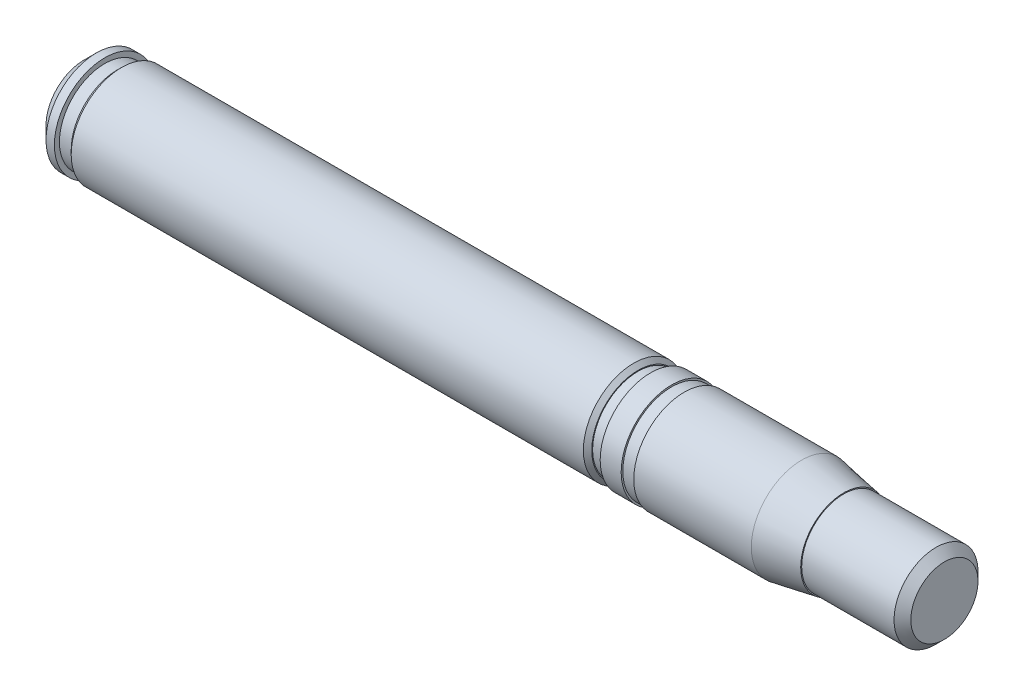
ISO-10303-21;
HEADER;
FILE_DESCRIPTION(('STEP AP214'),'2;1');
FILE_NAME('part.step','',(''),(''),'','','');
FILE_SCHEMA(('AUTOMOTIVE_DESIGN { 1 0 10303 214 1 1 1 1 }'));
ENDSEC;
DATA;
#1=APPLICATION_CONTEXT('core data for automotive mechanical design processes');
#2=APPLICATION_PROTOCOL_DEFINITION('international standard','automotive_design',2000,#1);
#3=PRODUCT_CONTEXT('',#1,'mechanical');
#4=PRODUCT('Part','Part','',(#3));
#5=PRODUCT_RELATED_PRODUCT_CATEGORY('part','',(#4));
#6=PRODUCT_DEFINITION_FORMATION('','',#4);
#7=PRODUCT_DEFINITION_CONTEXT('part definition',#1,'design');
#8=PRODUCT_DEFINITION('design','',#6,#7);
#9=PRODUCT_DEFINITION_SHAPE('','',#8);
#10=(LENGTH_UNIT() NAMED_UNIT(*) SI_UNIT(.MILLI.,.METRE.));
#11=(NAMED_UNIT(*) PLANE_ANGLE_UNIT() SI_UNIT($,.RADIAN.));
#12=(NAMED_UNIT(*) SI_UNIT($,.STERADIAN.) SOLID_ANGLE_UNIT());
#13=UNCERTAINTY_MEASURE_WITH_UNIT(LENGTH_MEASURE(1.E-05),#10,'distance_accuracy_value','');
#14=(GEOMETRIC_REPRESENTATION_CONTEXT(3) GLOBAL_UNCERTAINTY_ASSIGNED_CONTEXT((#13)) GLOBAL_UNIT_ASSIGNED_CONTEXT((#10,
#11,#12)) REPRESENTATION_CONTEXT('',''));
#15=CARTESIAN_POINT('',(0.,0.,0.));
#16=DIRECTION('',(0.,0.,1.));
#17=DIRECTION('',(1.,0.,0.));
#18=AXIS2_PLACEMENT_3D('',#15,#16,#17);
#19=CARTESIAN_POINT('',(-64.7884891348913,0.,0.));
#20=DIRECTION('',(1.,0.,0.));
#21=DIRECTION('',(0.,0.,-1.));
#22=AXIS2_PLACEMENT_3D('',#19,#20,#21);
#23=PLANE('',#22);
#24=CARTESIAN_POINT('',(-64.7884891348913,0.,0.));
#25=DIRECTION('',(1.,0.,0.));
#26=DIRECTION('',(0.,0.,-1.));
#27=AXIS2_PLACEMENT_3D('',#24,#25,#26);
#28=CIRCLE('',#27,4.5);
#29=CARTESIAN_POINT('',(-64.7884891348913,0.,-4.5));
#30=VERTEX_POINT('',#29);
#31=EDGE_CURVE('E57',#30,#30,#28,.F.);
#32=ORIENTED_EDGE('',*,*,#31,.T.);
#33=EDGE_LOOP('',(#32));
#34=FACE_BOUND('',#33,.T.);
#35=ADVANCED_FACE('F35',(#34),#23,.F.);
#36=CARTESIAN_POINT('',(-77.6742824928249,0.,0.));
#37=DIRECTION('',(-1.,0.,0.));
#38=DIRECTION('',(0.,0.,1.));
#39=AXIS2_PLACEMENT_3D('',#36,#37,#38);
#40=CYLINDRICAL_SURFACE('',#39,6.);
#41=CARTESIAN_POINT('',(-63.2884891348913,0.,0.));
#42=DIRECTION('',(1.,0.,0.));
#43=DIRECTION('',(0.,0.,-1.));
#44=AXIS2_PLACEMENT_3D('',#41,#42,#43);
#45=CIRCLE('',#44,6.);
#46=CARTESIAN_POINT('',(-63.2884891348913,0.,-6.));
#47=VERTEX_POINT('',#46);
#48=EDGE_CURVE('E54',#47,#47,#45,.T.);
#49=ORIENTED_EDGE('',*,*,#48,.T.);
#50=EDGE_LOOP('',(#49));
#51=FACE_BOUND('',#50,.T.);
#52=CARTESIAN_POINT('',(-62.2884891348913,0.,0.));
#53=DIRECTION('',(-1.,0.,0.));
#54=DIRECTION('',(0.,0.,1.));
#55=AXIS2_PLACEMENT_3D('',#52,#53,#54);
#56=CIRCLE('',#55,6.);
#57=CARTESIAN_POINT('',(-62.2884891348913,0.,6.));
#58=VERTEX_POINT('',#57);
#59=EDGE_CURVE('E66',#58,#58,#56,.T.);
#60=ORIENTED_EDGE('',*,*,#59,.T.);
#61=EDGE_LOOP('',(#60));
#62=FACE_BOUND('',#61,.T.);
#63=ADVANCED_FACE('F124',(#51,#62),#40,.T.);
#64=CARTESIAN_POINT('',(-62.2884891348913,6.,0.));
#65=DIRECTION('',(-1.,0.,0.));
#66=DIRECTION('',(0.,0.,1.));
#67=AXIS2_PLACEMENT_3D('',#64,#65,#66);
#68=PLANE('',#67);
#69=ORIENTED_EDGE('',*,*,#59,.F.);
#70=EDGE_LOOP('',(#69));
#71=FACE_BOUND('',#70,.T.);
#72=CARTESIAN_POINT('',(-62.2884891348913,0.,0.));
#73=DIRECTION('',(-1.,0.,0.));
#74=DIRECTION('',(0.,0.,1.));
#75=AXIS2_PLACEMENT_3D('',#72,#73,#74);
#76=CIRCLE('',#75,5.4);
#77=CARTESIAN_POINT('',(-62.2884891348913,0.,5.4));
#78=VERTEX_POINT('',#77);
#79=EDGE_CURVE('E69',#78,#78,#76,.T.);
#80=ORIENTED_EDGE('',*,*,#79,.T.);
#81=EDGE_LOOP('',(#80));
#82=FACE_BOUND('',#81,.T.);
#83=ADVANCED_FACE('F129',(#71,#82),#68,.F.);
#84=CARTESIAN_POINT('',(-77.6742824928249,0.,0.));
#85=DIRECTION('',(-1.,0.,0.));
#86=DIRECTION('',(0.,0.,1.));
#87=AXIS2_PLACEMENT_3D('',#84,#85,#86);
#88=CYLINDRICAL_SURFACE('',#87,5.4);
#89=ORIENTED_EDGE('',*,*,#79,.F.);
#90=EDGE_LOOP('',(#89));
#91=FACE_BOUND('',#90,.T.);
#92=CARTESIAN_POINT('',(-60.7884891348913,0.,0.));
#93=DIRECTION('',(-1.,0.,0.));
#94=DIRECTION('',(0.,0.,1.));
#95=AXIS2_PLACEMENT_3D('',#92,#93,#94);
#96=CIRCLE('',#95,5.4);
#97=CARTESIAN_POINT('',(-60.7884891348913,0.,5.4));
#98=VERTEX_POINT('',#97);
#99=EDGE_CURVE('E72',#98,#98,#96,.T.);
#100=ORIENTED_EDGE('',*,*,#99,.T.);
#101=EDGE_LOOP('',(#100));
#102=FACE_BOUND('',#101,.T.);
#103=ADVANCED_FACE('F168',(#91,#102),#88,.T.);
#104=CARTESIAN_POINT('',(-60.7884891348913,5.4,0.));
#105=DIRECTION('',(1.,0.,0.));
#106=DIRECTION('',(0.,0.,-1.));
#107=AXIS2_PLACEMENT_3D('',#104,#105,#106);
#108=PLANE('',#107);
#109=CARTESIAN_POINT('',(-60.7884891348913,0.,0.));
#110=DIRECTION('',(1.,0.,0.));
#111=DIRECTION('',(0.,0.,-1.));
#112=AXIS2_PLACEMENT_3D('',#109,#110,#111);
#113=CIRCLE('',#112,5.5);
#114=CARTESIAN_POINT('',(-60.7884891348913,0.,-5.5));
#115=VERTEX_POINT('',#114);
#116=EDGE_CURVE('E10',#115,#115,#113,.F.);
#117=ORIENTED_EDGE('',*,*,#116,.T.);
#118=EDGE_LOOP('',(#117));
#119=FACE_BOUND('',#118,.T.);
#120=ORIENTED_EDGE('',*,*,#99,.F.);
#121=EDGE_LOOP('',(#120));
#122=FACE_BOUND('',#121,.T.);
#123=ADVANCED_FACE('F159',(#119,#122),#108,.F.);
#124=CARTESIAN_POINT('',(-77.6742824928249,0.,0.));
#125=DIRECTION('',(-1.,0.,0.));
#126=DIRECTION('',(0.,0.,1.));
#127=AXIS2_PLACEMENT_3D('',#124,#125,#126);
#128=CYLINDRICAL_SURFACE('',#127,6.);
#129=CARTESIAN_POINT('',(0.711510865108678,0.,0.));
#130=DIRECTION('',(-1.,0.,0.));
#131=DIRECTION('',(0.,0.,1.));
#132=AXIS2_PLACEMENT_3D('',#129,#130,#131);
#133=CIRCLE('',#132,6.);
#134=CARTESIAN_POINT('',(0.711510865108678,0.,6.));
#135=VERTEX_POINT('',#134);
#136=EDGE_CURVE('E45',#135,#135,#133,.T.);
#137=ORIENTED_EDGE('',*,*,#136,.T.);
#138=EDGE_LOOP('',(#137));
#139=FACE_BOUND('',#138,.T.);
#140=CARTESIAN_POINT('',(-60.2884891348913,0.,0.));
#141=DIRECTION('',(1.,0.,0.));
#142=DIRECTION('',(0.,0.,-1.));
#143=AXIS2_PLACEMENT_3D('',#140,#141,#142);
#144=CIRCLE('',#143,6.);
#145=CARTESIAN_POINT('',(-60.2884891348913,0.,-6.));
#146=VERTEX_POINT('',#145);
#147=EDGE_CURVE('E49',#146,#146,#144,.T.);
#148=ORIENTED_EDGE('',*,*,#147,.T.);
#149=EDGE_LOOP('',(#148));
#150=FACE_BOUND('',#149,.T.);
#151=ADVANCED_FACE('F156',(#139,#150),#128,.T.);
#152=CARTESIAN_POINT('',(1.21151086510867,6.,0.));
#153=DIRECTION('',(-1.,0.,0.));
#154=DIRECTION('',(0.,0.,1.));
#155=AXIS2_PLACEMENT_3D('',#152,#153,#154);
#156=PLANE('',#155);
#157=CARTESIAN_POINT('',(1.21151086510867,0.,0.));
#158=DIRECTION('',(-1.,0.,0.));
#159=DIRECTION('',(0.,0.,1.));
#160=AXIS2_PLACEMENT_3D('',#157,#158,#159);
#161=CIRCLE('',#160,5.50000000000001);
#162=CARTESIAN_POINT('',(1.21151086510867,0.,5.50000000000001));
#163=VERTEX_POINT('',#162);
#164=EDGE_CURVE('E41',#163,#163,#161,.F.);
#165=ORIENTED_EDGE('',*,*,#164,.T.);
#166=EDGE_LOOP('',(#165));
#167=FACE_BOUND('',#166,.T.);
#168=CARTESIAN_POINT('',(1.21151086510868,0.,0.));
#169=DIRECTION('',(-1.,0.,0.));
#170=DIRECTION('',(0.,0.,1.));
#171=AXIS2_PLACEMENT_3D('',#168,#169,#170);
#172=CIRCLE('',#171,5.4);
#173=CARTESIAN_POINT('',(1.21151086510868,0.,5.4));
#174=VERTEX_POINT('',#173);
#175=EDGE_CURVE('E75',#174,#174,#172,.T.);
#176=ORIENTED_EDGE('',*,*,#175,.T.);
#177=EDGE_LOOP('',(#176));
#178=FACE_BOUND('',#177,.T.);
#179=ADVANCED_FACE('F158',(#167,#178),#156,.F.);
#180=CARTESIAN_POINT('',(-77.6742824928249,0.,0.));
#181=DIRECTION('',(-1.,0.,0.));
#182=DIRECTION('',(0.,0.,1.));
#183=AXIS2_PLACEMENT_3D('',#180,#181,#182);
#184=CYLINDRICAL_SURFACE('',#183,5.4);
#185=ORIENTED_EDGE('',*,*,#175,.F.);
#186=EDGE_LOOP('',(#185));
#187=FACE_BOUND('',#186,.T.);
#188=CARTESIAN_POINT('',(2.71151086510868,0.,0.));
#189=DIRECTION('',(-1.,0.,0.));
#190=DIRECTION('',(0.,0.,1.));
#191=AXIS2_PLACEMENT_3D('',#188,#189,#190);
#192=CIRCLE('',#191,5.4);
#193=CARTESIAN_POINT('',(2.71151086510868,0.,5.4));
#194=VERTEX_POINT('',#193);
#195=EDGE_CURVE('E78',#194,#194,#192,.T.);
#196=ORIENTED_EDGE('',*,*,#195,.T.);
#197=EDGE_LOOP('',(#196));
#198=FACE_BOUND('',#197,.T.);
#199=ADVANCED_FACE('F166',(#187,#198),#184,.T.);
#200=CARTESIAN_POINT('',(2.71151086510868,5.4,0.));
#201=DIRECTION('',(1.,0.,0.));
#202=DIRECTION('',(0.,0.,-1.));
#203=AXIS2_PLACEMENT_3D('',#200,#201,#202);
#204=PLANE('',#203);
#205=ORIENTED_EDGE('',*,*,#195,.F.);
#206=EDGE_LOOP('',(#205));
#207=FACE_BOUND('',#206,.T.);
#208=CARTESIAN_POINT('',(2.71151086510868,0.,0.));
#209=DIRECTION('',(-1.,0.,0.));
#210=DIRECTION('',(0.,0.,1.));
#211=AXIS2_PLACEMENT_3D('',#208,#209,#210);
#212=CIRCLE('',#211,6.);
#213=CARTESIAN_POINT('',(2.71151086510868,0.,6.));
#214=VERTEX_POINT('',#213);
#215=EDGE_CURVE('E81',#214,#214,#212,.T.);
#216=ORIENTED_EDGE('',*,*,#215,.T.);
#217=EDGE_LOOP('',(#216));
#218=FACE_BOUND('',#217,.T.);
#219=ADVANCED_FACE('F298',(#207,#218),#204,.F.);
#220=CARTESIAN_POINT('',(-77.6742824928249,0.,0.));
#221=DIRECTION('',(-1.,0.,0.));
#222=DIRECTION('',(0.,0.,1.));
#223=AXIS2_PLACEMENT_3D('',#220,#221,#222);
#224=CYLINDRICAL_SURFACE('',#223,6.);
#225=ORIENTED_EDGE('',*,*,#215,.F.);
#226=EDGE_LOOP('',(#225));
#227=FACE_BOUND('',#226,.T.);
#228=CARTESIAN_POINT('',(5.21151086510868,0.,0.));
#229=DIRECTION('',(-1.,0.,0.));
#230=DIRECTION('',(0.,0.,1.));
#231=AXIS2_PLACEMENT_3D('',#228,#229,#230);
#232=CIRCLE('',#231,6.);
#233=CARTESIAN_POINT('',(5.21151086510868,0.,6.));
#234=VERTEX_POINT('',#233);
#235=EDGE_CURVE('E84',#234,#234,#232,.T.);
#236=ORIENTED_EDGE('',*,*,#235,.T.);
#237=EDGE_LOOP('',(#236));
#238=FACE_BOUND('',#237,.T.);
#239=ADVANCED_FACE('F289',(#227,#238),#224,.T.);
#240=CARTESIAN_POINT('',(5.21151086510867,6.,0.));
#241=DIRECTION('',(-1.,0.,0.));
#242=DIRECTION('',(0.,0.,1.));
#243=AXIS2_PLACEMENT_3D('',#240,#241,#242);
#244=PLANE('',#243);
#245=ORIENTED_EDGE('',*,*,#235,.F.);
#246=EDGE_LOOP('',(#245));
#247=FACE_BOUND('',#246,.T.);
#248=CARTESIAN_POINT('',(5.21151086510867,0.,0.));
#249=DIRECTION('',(-1.,0.,0.));
#250=DIRECTION('',(0.,0.,1.));
#251=AXIS2_PLACEMENT_3D('',#248,#249,#250);
#252=CIRCLE('',#251,5.8);
#253=CARTESIAN_POINT('',(5.21151086510867,0.,5.8));
#254=VERTEX_POINT('',#253);
#255=EDGE_CURVE('E87',#254,#254,#252,.T.);
#256=ORIENTED_EDGE('',*,*,#255,.T.);
#257=EDGE_LOOP('',(#256));
#258=FACE_BOUND('',#257,.T.);
#259=ADVANCED_FACE('F280',(#247,#258),#244,.F.);
#260=CARTESIAN_POINT('',(-77.6742824928249,0.,0.));
#261=DIRECTION('',(-1.,0.,0.));
#262=DIRECTION('',(0.,0.,1.));
#263=AXIS2_PLACEMENT_3D('',#260,#261,#262);
#264=CYLINDRICAL_SURFACE('',#263,5.8);
#265=ORIENTED_EDGE('',*,*,#255,.F.);
#266=EDGE_LOOP('',(#265));
#267=FACE_BOUND('',#266,.T.);
#268=CARTESIAN_POINT('',(6.71151086510867,0.,0.));
#269=DIRECTION('',(-1.,0.,0.));
#270=DIRECTION('',(0.,0.,1.));
#271=AXIS2_PLACEMENT_3D('',#268,#269,#270);
#272=CIRCLE('',#271,5.8);
#273=CARTESIAN_POINT('',(6.71151086510867,0.,5.8));
#274=VERTEX_POINT('',#273);
#275=EDGE_CURVE('E90',#274,#274,#272,.T.);
#276=ORIENTED_EDGE('',*,*,#275,.T.);
#277=EDGE_LOOP('',(#276));
#278=FACE_BOUND('',#277,.T.);
#279=ADVANCED_FACE('F271',(#267,#278),#264,.T.);
#280=CARTESIAN_POINT('',(6.71151086510867,5.8,0.));
#281=DIRECTION('',(1.,0.,0.));
#282=DIRECTION('',(0.,0.,-1.));
#283=AXIS2_PLACEMENT_3D('',#280,#281,#282);
#284=PLANE('',#283);
#285=ORIENTED_EDGE('',*,*,#275,.F.);
#286=EDGE_LOOP('',(#285));
#287=FACE_BOUND('',#286,.T.);
#288=CARTESIAN_POINT('',(6.71151086510868,0.,0.));
#289=DIRECTION('',(-1.,0.,0.));
#290=DIRECTION('',(0.,0.,1.));
#291=AXIS2_PLACEMENT_3D('',#288,#289,#290);
#292=CIRCLE('',#291,6.);
#293=CARTESIAN_POINT('',(6.71151086510868,0.,6.));
#294=VERTEX_POINT('',#293);
#295=EDGE_CURVE('E93',#294,#294,#292,.T.);
#296=ORIENTED_EDGE('',*,*,#295,.T.);
#297=EDGE_LOOP('',(#296));
#298=FACE_BOUND('',#297,.T.);
#299=ADVANCED_FACE('F262',(#287,#298),#284,.F.);
#300=CARTESIAN_POINT('',(-77.6742824928249,0.,0.));
#301=DIRECTION('',(-1.,0.,0.));
#302=DIRECTION('',(0.,0.,1.));
#303=AXIS2_PLACEMENT_3D('',#300,#301,#302);
#304=CYLINDRICAL_SURFACE('',#303,6.);
#305=ORIENTED_EDGE('',*,*,#295,.F.);
#306=EDGE_LOOP('',(#305));
#307=FACE_BOUND('',#306,.T.);
#308=CARTESIAN_POINT('',(20.7115108651087,0.,0.));
#309=DIRECTION('',(-1.,0.,0.));
#310=DIRECTION('',(0.,0.,1.));
#311=AXIS2_PLACEMENT_3D('',#308,#309,#310);
#312=CIRCLE('',#311,6.);
#313=CARTESIAN_POINT('',(20.7115108651087,0.,6.));
#314=VERTEX_POINT('',#313);
#315=EDGE_CURVE('E96',#314,#314,#312,.T.);
#316=ORIENTED_EDGE('',*,*,#315,.T.);
#317=EDGE_LOOP('',(#316));
#318=FACE_BOUND('',#317,.T.);
#319=ADVANCED_FACE('F253',(#307,#318),#304,.T.);
#320=CARTESIAN_POINT('',(25.7115108651087,0.,0.));
#321=DIRECTION('',(-1.,0.,0.));
#322=DIRECTION('',(0.,0.,1.));
#323=AXIS2_PLACEMENT_3D('',#320,#321,#322);
#324=CONICAL_SURFACE('',#323,5.11836509645767,0.174532925199433);
#325=ORIENTED_EDGE('',*,*,#315,.F.);
#326=EDGE_LOOP('',(#325));
#327=FACE_BOUND('',#326,.T.);
#328=CARTESIAN_POINT('',(25.7115108651087,0.,0.));
#329=DIRECTION('',(-1.,0.,0.));
#330=DIRECTION('',(0.,0.,1.));
#331=AXIS2_PLACEMENT_3D('',#328,#329,#330);
#332=CIRCLE('',#331,5.11836509645767);
#333=CARTESIAN_POINT('',(25.7115108651087,0.,5.11836509645767));
#334=VERTEX_POINT('',#333);
#335=EDGE_CURVE('E99',#334,#334,#332,.T.);
#336=ORIENTED_EDGE('',*,*,#335,.T.);
#337=EDGE_LOOP('',(#336));
#338=FACE_BOUND('',#337,.T.);
#339=ADVANCED_FACE('F120',(#327,#338),#324,.T.);
#340=CARTESIAN_POINT('',(25.7115108651087,5.11836509645767,0.));
#341=DIRECTION('',(-1.,0.,0.));
#342=DIRECTION('',(0.,0.,1.));
#343=AXIS2_PLACEMENT_3D('',#340,#341,#342);
#344=PLANE('',#343);
#345=ORIENTED_EDGE('',*,*,#335,.F.);
#346=EDGE_LOOP('',(#345));
#347=FACE_BOUND('',#346,.T.);
#348=CARTESIAN_POINT('',(25.7115108651087,0.,0.));
#349=DIRECTION('',(-1.,0.,0.));
#350=DIRECTION('',(0.,0.,1.));
#351=AXIS2_PLACEMENT_3D('',#348,#349,#350);
#352=CIRCLE('',#351,5.);
#353=CARTESIAN_POINT('',(25.7115108651087,0.,5.));
#354=VERTEX_POINT('',#353);
#355=EDGE_CURVE('E102',#354,#354,#352,.T.);
#356=ORIENTED_EDGE('',*,*,#355,.T.);
#357=EDGE_LOOP('',(#356));
#358=FACE_BOUND('',#357,.T.);
#359=ADVANCED_FACE('F106',(#347,#358),#344,.F.);
#360=CARTESIAN_POINT('',(-77.6742824928249,0.,0.));
#361=DIRECTION('',(-1.,0.,0.));
#362=DIRECTION('',(0.,0.,1.));
#363=AXIS2_PLACEMENT_3D('',#360,#361,#362);
#364=CYLINDRICAL_SURFACE('',#363,5.);
#365=CARTESIAN_POINT('',(36.7115108651087,0.,0.));
#366=DIRECTION('',(-1.,0.,0.));
#367=DIRECTION('',(0.,0.,1.));
#368=AXIS2_PLACEMENT_3D('',#365,#366,#367);
#369=CIRCLE('',#368,5.);
#370=CARTESIAN_POINT('',(36.7115108651087,0.,5.));
#371=VERTEX_POINT('',#370);
#372=EDGE_CURVE('E63',#371,#371,#369,.T.);
#373=ORIENTED_EDGE('',*,*,#372,.T.);
#374=EDGE_LOOP('',(#373));
#375=FACE_BOUND('',#374,.T.);
#376=ORIENTED_EDGE('',*,*,#355,.F.);
#377=EDGE_LOOP('',(#376));
#378=FACE_BOUND('',#377,.T.);
#379=ADVANCED_FACE('F108',(#375,#378),#364,.T.);
#380=CARTESIAN_POINT('',(37.7115108651087,5.,0.));
#381=DIRECTION('',(-1.,0.,0.));
#382=DIRECTION('',(0.,0.,1.));
#383=AXIS2_PLACEMENT_3D('',#380,#381,#382);
#384=PLANE('',#383);
#385=CARTESIAN_POINT('',(37.7115108651087,0.,0.));
#386=DIRECTION('',(-1.,0.,0.));
#387=DIRECTION('',(0.,0.,1.));
#388=AXIS2_PLACEMENT_3D('',#385,#386,#387);
#389=CIRCLE('',#388,4.);
#390=CARTESIAN_POINT('',(37.7115108651087,0.,4.));
#391=VERTEX_POINT('',#390);
#392=EDGE_CURVE('E60',#391,#391,#389,.F.);
#393=ORIENTED_EDGE('',*,*,#392,.T.);
#394=EDGE_LOOP('',(#393));
#395=FACE_BOUND('',#394,.T.);
#396=ADVANCED_FACE('F110',(#395),#384,.F.);
#397=CARTESIAN_POINT('',(36.7115108651087,0.,0.));
#398=DIRECTION('',(-1.,0.,0.));
#399=DIRECTION('',(0.,0.,1.));
#400=AXIS2_PLACEMENT_3D('',#397,#398,#399);
#401=CONICAL_SURFACE('',#400,5.,0.785398163397456);
#402=ORIENTED_EDGE('',*,*,#392,.F.);
#403=EDGE_LOOP('',(#402));
#404=FACE_BOUND('',#403,.T.);
#405=ORIENTED_EDGE('',*,*,#372,.F.);
#406=EDGE_LOOP('',(#405));
#407=FACE_BOUND('',#406,.T.);
#408=ADVANCED_FACE('F117',(#404,#407),#401,.T.);
#409=CARTESIAN_POINT('',(-64.7884891348913,0.,0.));
#410=DIRECTION('',(1.,0.,0.));
#411=DIRECTION('',(0.,0.,-1.));
#412=AXIS2_PLACEMENT_3D('',#409,#410,#411);
#413=CONICAL_SURFACE('',#412,4.5,0.785398163397449);
#414=ORIENTED_EDGE('',*,*,#48,.F.);
#415=EDGE_LOOP('',(#414));
#416=FACE_BOUND('',#415,.T.);
#417=ORIENTED_EDGE('',*,*,#31,.F.);
#418=EDGE_LOOP('',(#417));
#419=FACE_BOUND('',#418,.T.);
#420=ADVANCED_FACE('F133',(#416,#419),#413,.T.);
#421=CARTESIAN_POINT('',(0.711510865108678,0.,0.));
#422=DIRECTION('',(-1.,0.,0.));
#423=DIRECTION('',(0.,0.,1.));
#424=AXIS2_PLACEMENT_3D('',#421,#422,#423);
#425=CONICAL_SURFACE('',#424,6.,0.785398163397442);
#426=ORIENTED_EDGE('',*,*,#164,.F.);
#427=EDGE_LOOP('',(#426));
#428=FACE_BOUND('',#427,.T.);
#429=ORIENTED_EDGE('',*,*,#136,.F.);
#430=EDGE_LOOP('',(#429));
#431=FACE_BOUND('',#430,.T.);
#432=ADVANCED_FACE('F135',(#428,#431),#425,.T.);
#433=CARTESIAN_POINT('',(-60.7884891348913,0.,0.));
#434=DIRECTION('',(1.,0.,0.));
#435=DIRECTION('',(0.,0.,-1.));
#436=AXIS2_PLACEMENT_3D('',#433,#434,#435);
#437=CONICAL_SURFACE('',#436,5.5,0.785398163397442);
#438=ORIENTED_EDGE('',*,*,#147,.F.);
#439=EDGE_LOOP('',(#438));
#440=FACE_BOUND('',#439,.T.);
#441=ORIENTED_EDGE('',*,*,#116,.F.);
#442=EDGE_LOOP('',(#441));
#443=FACE_BOUND('',#442,.T.);
#444=ADVANCED_FACE('F142',(#440,#443),#437,.T.);
#445=CLOSED_SHELL('',(#35,#63,#83,#103,#123,#151,#179,#199,#219,#239,#259,#279,#299,#319,#339,
#359,#379,#396,#408,#420,#432,#444));
#446=MANIFOLD_SOLID_BREP('B2',#445);
#447=ADVANCED_BREP_SHAPE_REPRESENTATION('',(#18,#446),#14);
#448=SHAPE_DEFINITION_REPRESENTATION(#9,#447);
ENDSEC;
END-ISO-10303-21;
